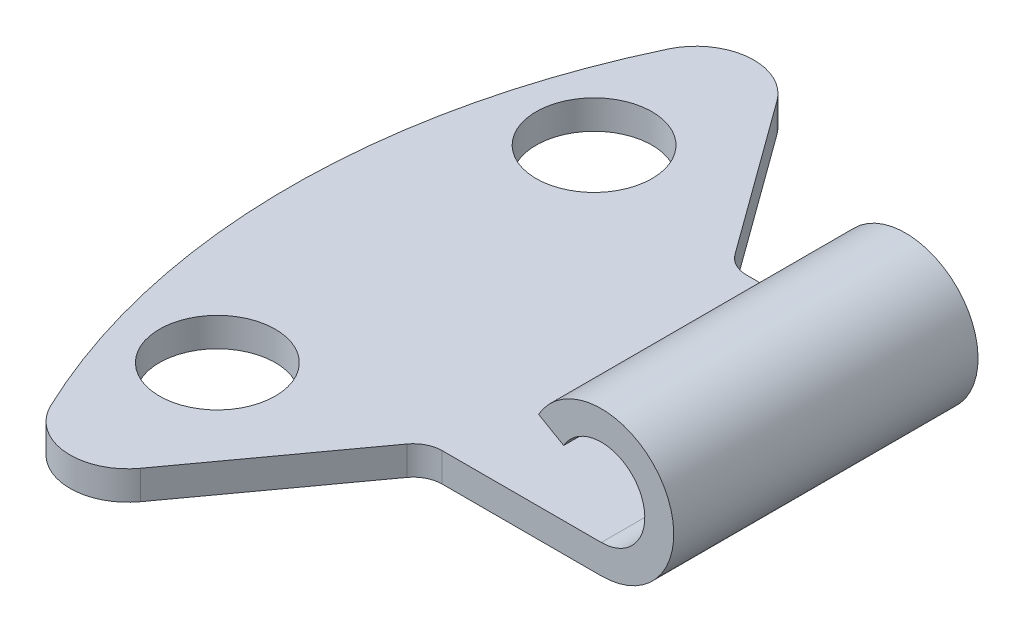
ISO-10303-21;
HEADER;
FILE_DESCRIPTION(('STEP AP214'),'2;1');
FILE_NAME('part.step','',(''),(''),'','','');
FILE_SCHEMA(('AUTOMOTIVE_DESIGN { 1 0 10303 214 1 1 1 1 }'));
ENDSEC;
DATA;
#1=APPLICATION_CONTEXT('core data for automotive mechanical design processes');
#2=APPLICATION_PROTOCOL_DEFINITION('international standard','automotive_design',2000,#1);
#3=PRODUCT_CONTEXT('',#1,'mechanical');
#4=PRODUCT('Part','Part','',(#3));
#5=PRODUCT_RELATED_PRODUCT_CATEGORY('part','',(#4));
#6=PRODUCT_DEFINITION_FORMATION('','',#4);
#7=PRODUCT_DEFINITION_CONTEXT('part definition',#1,'design');
#8=PRODUCT_DEFINITION('design','',#6,#7);
#9=PRODUCT_DEFINITION_SHAPE('','',#8);
#10=(LENGTH_UNIT() NAMED_UNIT(*) SI_UNIT(.MILLI.,.METRE.));
#11=(NAMED_UNIT(*) PLANE_ANGLE_UNIT() SI_UNIT($,.RADIAN.));
#12=(NAMED_UNIT(*) SI_UNIT($,.STERADIAN.) SOLID_ANGLE_UNIT());
#13=UNCERTAINTY_MEASURE_WITH_UNIT(LENGTH_MEASURE(1.E-05),#10,'distance_accuracy_value','');
#14=(GEOMETRIC_REPRESENTATION_CONTEXT(3) GLOBAL_UNCERTAINTY_ASSIGNED_CONTEXT((#13)) GLOBAL_UNIT_ASSIGNED_CONTEXT((#10,
#11,#12)) REPRESENTATION_CONTEXT('',''));
#15=CARTESIAN_POINT('',(0.,0.,0.));
#16=DIRECTION('',(0.,0.,1.));
#17=DIRECTION('',(1.,0.,0.));
#18=AXIS2_PLACEMENT_3D('',#15,#16,#17);
#19=CARTESIAN_POINT('',(8.,2.5,27.));
#20=DIRECTION('',(0.,0.,-1.));
#21=DIRECTION('',(-1.,0.,0.));
#22=AXIS2_PLACEMENT_3D('',#19,#20,#21);
#23=CYLINDRICAL_SURFACE('',#22,2.5);
#24=CARTESIAN_POINT('',(8.,2.5,8.25));
#25=DIRECTION('',(0.,0.,-1.));
#26=DIRECTION('',(-1.,0.,0.));
#27=AXIS2_PLACEMENT_3D('',#24,#25,#26);
#28=CIRCLE('',#27,2.5);
#29=CARTESIAN_POINT('',(5.83493649053891,3.75000000000001,8.25));
#30=VERTEX_POINT('',#29);
#31=CARTESIAN_POINT('',(8.,0.,8.25));
#32=VERTEX_POINT('',#31);
#33=EDGE_CURVE('E269',#30,#32,#28,.T.);
#34=ORIENTED_EDGE('',*,*,#33,.F.);
#35=DIRECTION('',(0.,0.,-1.));
#36=VECTOR('',#35,1.);
#37=CARTESIAN_POINT('',(5.83493649053891,3.75000000000001,27.));
#38=LINE('',#37,#36);
#39=CARTESIAN_POINT('',(5.83493649053891,3.75000000000001,18.75));
#40=VERTEX_POINT('',#39);
#41=EDGE_CURVE('E311',#40,#30,#38,.T.);
#42=ORIENTED_EDGE('',*,*,#41,.F.);
#43=CARTESIAN_POINT('',(8.,2.5,18.75));
#44=DIRECTION('',(0.,0.,1.));
#45=DIRECTION('',(1.,0.,0.));
#46=AXIS2_PLACEMENT_3D('',#43,#44,#45);
#47=CIRCLE('',#46,2.5);
#48=CARTESIAN_POINT('',(8.,0.,18.75));
#49=VERTEX_POINT('',#48);
#50=EDGE_CURVE('E294',#49,#40,#47,.T.);
#51=ORIENTED_EDGE('',*,*,#50,.F.);
#52=DIRECTION('',(0.,0.,-1.));
#53=VECTOR('',#52,1.);
#54=CARTESIAN_POINT('',(8.,0.,27.));
#55=LINE('',#54,#53);
#56=EDGE_CURVE('E314',#49,#32,#55,.T.);
#57=ORIENTED_EDGE('',*,*,#56,.T.);
#58=EDGE_LOOP('',(#34,#42,#51,#57));
#59=FACE_BOUND('',#58,.T.);
#60=ADVANCED_FACE('F146',(#59),#23,.T.);
#61=CARTESIAN_POINT('',(5.83493649053891,3.75000000000001,27.));
#62=DIRECTION('',(0.500000000000003,0.866025403784437,0.));
#63=DIRECTION('',(-0.866025403784437,0.500000000000003,0.));
#64=AXIS2_PLACEMENT_3D('',#61,#62,#63);
#65=PLANE('',#64);
#66=DIRECTION('',(-0.866025403784437,0.500000000000003,0.));
#67=VECTOR('',#66,1.);
#68=CARTESIAN_POINT('',(5.8349364905389,3.75000000000002,8.25));
#69=LINE('',#68,#67);
#70=CARTESIAN_POINT('',(6.70096189432335,3.25000000000001,8.25));
#71=VERTEX_POINT('',#70);
#72=EDGE_CURVE('E267',#71,#30,#69,.T.);
#73=ORIENTED_EDGE('',*,*,#72,.F.);
#74=DIRECTION('',(0.,0.,-1.));
#75=VECTOR('',#74,1.);
#76=CARTESIAN_POINT('',(6.70096189432335,3.25000000000001,27.));
#77=LINE('',#76,#75);
#78=CARTESIAN_POINT('',(6.70096189432335,3.25000000000001,18.75));
#79=VERTEX_POINT('',#78);
#80=EDGE_CURVE('E308',#79,#71,#77,.T.);
#81=ORIENTED_EDGE('',*,*,#80,.F.);
#82=DIRECTION('',(0.866025403784437,-0.500000000000003,0.));
#83=VECTOR('',#82,1.);
#84=CARTESIAN_POINT('',(5.83493649053891,3.75000000000001,18.75));
#85=LINE('',#84,#83);
#86=EDGE_CURVE('E292',#40,#79,#85,.T.);
#87=ORIENTED_EDGE('',*,*,#86,.F.);
#88=ORIENTED_EDGE('',*,*,#41,.T.);
#89=EDGE_LOOP('',(#73,#81,#87,#88));
#90=FACE_BOUND('',#89,.T.);
#91=ADVANCED_FACE('F348',(#90),#65,.F.);
#92=CARTESIAN_POINT('',(8.,2.5,27.));
#93=DIRECTION('',(0.,0.,-1.));
#94=DIRECTION('',(-1.,0.,0.));
#95=AXIS2_PLACEMENT_3D('',#92,#93,#94);
#96=CYLINDRICAL_SURFACE('',#95,1.5);
#97=CARTESIAN_POINT('',(8.,2.5,8.25));
#98=DIRECTION('',(0.,0.,-1.));
#99=DIRECTION('',(-1.,0.,0.));
#100=AXIS2_PLACEMENT_3D('',#97,#98,#99);
#101=CIRCLE('',#100,1.5);
#102=CARTESIAN_POINT('',(8.,1.,8.25));
#103=VERTEX_POINT('',#102);
#104=EDGE_CURVE('E247',#103,#71,#101,.F.);
#105=ORIENTED_EDGE('',*,*,#104,.F.);
#106=DIRECTION('',(0.,0.,-1.));
#107=VECTOR('',#106,1.);
#108=CARTESIAN_POINT('',(8.,1.,27.));
#109=LINE('',#108,#107);
#110=CARTESIAN_POINT('',(8.,1.,18.75));
#111=VERTEX_POINT('',#110);
#112=EDGE_CURVE('E305',#111,#103,#109,.T.);
#113=ORIENTED_EDGE('',*,*,#112,.F.);
#114=CARTESIAN_POINT('',(8.,2.5,18.75));
#115=DIRECTION('',(0.,0.,1.));
#116=DIRECTION('',(1.,0.,0.));
#117=AXIS2_PLACEMENT_3D('',#114,#115,#116);
#118=CIRCLE('',#117,1.5);
#119=EDGE_CURVE('E161',#79,#111,#118,.F.);
#120=ORIENTED_EDGE('',*,*,#119,.F.);
#121=ORIENTED_EDGE('',*,*,#80,.T.);
#122=EDGE_LOOP('',(#105,#113,#120,#121));
#123=FACE_BOUND('',#122,.T.);
#124=ADVANCED_FACE('F343',(#123),#96,.F.);
#125=CARTESIAN_POINT('',(-8.,0.,27.));
#126=DIRECTION('',(0.,1.,0.));
#127=DIRECTION('',(0.,0.,1.));
#128=AXIS2_PLACEMENT_3D('',#125,#126,#127);
#129=PLANE('',#128);
#130=CARTESIAN_POINT('',(-4.,0.,20.));
#131=DIRECTION('',(0.,1.,0.));
#132=DIRECTION('',(0.,0.,1.));
#133=AXIS2_PLACEMENT_3D('',#130,#131,#132);
#134=CIRCLE('',#133,2.);
#135=CARTESIAN_POINT('',(-4.,0.,22.));
#136=VERTEX_POINT('',#135);
#137=EDGE_CURVE('E284',#136,#136,#134,.F.);
#138=ORIENTED_EDGE('',*,*,#137,.F.);
#139=EDGE_LOOP('',(#138));
#140=FACE_BOUND('',#139,.T.);
#141=CARTESIAN_POINT('',(-4.,0.,7.));
#142=DIRECTION('',(0.,1.,0.));
#143=DIRECTION('',(0.,0.,1.));
#144=AXIS2_PLACEMENT_3D('',#141,#142,#143);
#145=CIRCLE('',#144,2.);
#146=CARTESIAN_POINT('',(-4.,0.,9.));
#147=VERTEX_POINT('',#146);
#148=EDGE_CURVE('E288',#147,#147,#145,.F.);
#149=ORIENTED_EDGE('',*,*,#148,.F.);
#150=EDGE_LOOP('',(#149));
#151=FACE_BOUND('',#150,.T.);
#152=DIRECTION('',(-1.,0.,0.));
#153=VECTOR('',#152,1.);
#154=CARTESIAN_POINT('',(-8.00000000000001,0.,8.25000000000001));
#155=LINE('',#154,#153);
#156=CARTESIAN_POINT('',(2.50922459170322,0.,8.25));
#157=VERTEX_POINT('',#156);
#158=EDGE_CURVE('E271',#32,#157,#155,.T.);
#159=ORIENTED_EDGE('',*,*,#158,.F.);
#160=ORIENTED_EDGE('',*,*,#56,.F.);
#161=DIRECTION('',(1.,0.,0.));
#162=VECTOR('',#161,1.);
#163=CARTESIAN_POINT('',(-8.,0.,18.75));
#164=LINE('',#163,#162);
#165=CARTESIAN_POINT('',(2.50922459170323,0.,18.75));
#166=VERTEX_POINT('',#165);
#167=EDGE_CURVE('E296',#166,#49,#164,.T.);
#168=ORIENTED_EDGE('',*,*,#167,.F.);
#169=CARTESIAN_POINT('',(2.50922459170322,0.,19.75));
#170=DIRECTION('',(0.,1.,0.));
#171=DIRECTION('',(0.,0.,1.));
#172=AXIS2_PLACEMENT_3D('',#169,#170,#171);
#173=CIRCLE('',#172,1.);
#174=CARTESIAN_POINT('',(1.70048850740003,0.,19.1618283023249));
#175=VERTEX_POINT('',#174);
#176=EDGE_CURVE('E303',#175,#166,#173,.F.);
#177=ORIENTED_EDGE('',*,*,#176,.F.);
#178=DIRECTION('',(0.588171697675046,0.,-0.808736084303189));
#179=VECTOR('',#178,1.);
#180=CARTESIAN_POINT('',(-5.38378378378378,0.,28.9027027027027));
#181=LINE('',#180,#179);
#182=CARTESIAN_POINT('',(-2.16600265264094,0.,24.4782536473813));
#183=VERTEX_POINT('',#182);
#184=EDGE_CURVE('E169',#183,#175,#181,.T.);
#185=ORIENTED_EDGE('',*,*,#184,.F.);
#186=CARTESIAN_POINT('',(-3.78347482124732,0.,23.3019102520312));
#187=DIRECTION('',(0.,1.,0.));
#188=DIRECTION('',(0.,0.,1.));
#189=AXIS2_PLACEMENT_3D('',#186,#187,#188);
#190=CIRCLE('',#189,2.);
#191=CARTESIAN_POINT('',(-5.5888827616586,0.,24.1624346088625));
#192=VERTEX_POINT('',#191);
#193=EDGE_CURVE('E300',#192,#183,#190,.T.);
#194=ORIENTED_EDGE('',*,*,#193,.F.);
#195=CARTESIAN_POINT('',(16.78125,0.,13.5));
#196=DIRECTION('',(0.,1.,0.));
#197=DIRECTION('',(0.,0.,1.));
#198=AXIS2_PLACEMENT_3D('',#195,#196,#197);
#199=CIRCLE('',#198,24.78125);
#200=CARTESIAN_POINT('',(-5.58888276165861,0.,2.83756539113753));
#201=VERTEX_POINT('',#200);
#202=EDGE_CURVE('E298',#201,#192,#199,.T.);
#203=ORIENTED_EDGE('',*,*,#202,.F.);
#204=CARTESIAN_POINT('',(-3.78347482124732,0.,3.6980897479688));
#205=DIRECTION('',(0.,1.,0.));
#206=DIRECTION('',(0.,0.,1.));
#207=AXIS2_PLACEMENT_3D('',#204,#205,#206);
#208=CIRCLE('',#207,2.);
#209=CARTESIAN_POINT('',(-2.16600265264094,0.,2.52174635261871));
#210=VERTEX_POINT('',#209);
#211=EDGE_CURVE('E248',#210,#201,#208,.T.);
#212=ORIENTED_EDGE('',*,*,#211,.F.);
#213=DIRECTION('',(-0.588171697675046,0.,-0.808736084303189));
#214=VECTOR('',#213,1.);
#215=CARTESIAN_POINT('',(7.45945945945946,0.,15.7567567567568));
#216=LINE('',#215,#214);
#217=CARTESIAN_POINT('',(1.70048850740003,0.,7.83817169767505));
#218=VERTEX_POINT('',#217);
#219=EDGE_CURVE('E253',#218,#210,#216,.T.);
#220=ORIENTED_EDGE('',*,*,#219,.F.);
#221=CARTESIAN_POINT('',(2.50922459170322,0.,7.25));
#222=DIRECTION('',(0.,1.,0.));
#223=DIRECTION('',(0.,0.,1.));
#224=AXIS2_PLACEMENT_3D('',#221,#222,#223);
#225=CIRCLE('',#224,1.);
#226=EDGE_CURVE('E237',#157,#218,#225,.F.);
#227=ORIENTED_EDGE('',*,*,#226,.F.);
#228=EDGE_LOOP('',(#159,#160,#168,#177,#185,#194,#203,#212,#220,#227));
#229=FACE_BOUND('',#228,.T.);
#230=ADVANCED_FACE('F148',(#140,#151,#229),#129,.F.);
#231=CARTESIAN_POINT('',(-8.,1.,27.));
#232=DIRECTION('',(0.,-1.,0.));
#233=DIRECTION('',(1.,0.,0.));
#234=AXIS2_PLACEMENT_3D('',#231,#232,#233);
#235=PLANE('',#234);
#236=CARTESIAN_POINT('',(-4.,1.,20.));
#237=DIRECTION('',(0.,-1.,0.));
#238=DIRECTION('',(1.,0.,0.));
#239=AXIS2_PLACEMENT_3D('',#236,#237,#238);
#240=CIRCLE('',#239,2.);
#241=CARTESIAN_POINT('',(-2.,1.,20.));
#242=VERTEX_POINT('',#241);
#243=EDGE_CURVE('E283',#242,#242,#240,.F.);
#244=ORIENTED_EDGE('',*,*,#243,.F.);
#245=EDGE_LOOP('',(#244));
#246=FACE_BOUND('',#245,.T.);
#247=CARTESIAN_POINT('',(-4.,1.,7.));
#248=DIRECTION('',(0.,-1.,0.));
#249=DIRECTION('',(1.,0.,0.));
#250=AXIS2_PLACEMENT_3D('',#247,#248,#249);
#251=CIRCLE('',#250,2.);
#252=CARTESIAN_POINT('',(-2.,1.,7.));
#253=VERTEX_POINT('',#252);
#254=EDGE_CURVE('E287',#253,#253,#251,.F.);
#255=ORIENTED_EDGE('',*,*,#254,.F.);
#256=EDGE_LOOP('',(#255));
#257=FACE_BOUND('',#256,.T.);
#258=DIRECTION('',(1.,0.,0.));
#259=VECTOR('',#258,1.);
#260=CARTESIAN_POINT('',(-8.00000000000001,1.,8.25000000000001));
#261=LINE('',#260,#259);
#262=CARTESIAN_POINT('',(2.50922459170322,1.,8.25));
#263=VERTEX_POINT('',#262);
#264=EDGE_CURVE('E12',#263,#103,#261,.T.);
#265=ORIENTED_EDGE('',*,*,#264,.F.);
#266=CARTESIAN_POINT('',(2.50922459170322,1.,7.25));
#267=DIRECTION('',(0.,-1.,0.));
#268=DIRECTION('',(1.,0.,0.));
#269=AXIS2_PLACEMENT_3D('',#266,#267,#268);
#270=CIRCLE('',#269,1.);
#271=CARTESIAN_POINT('',(1.70048850740003,1.,7.83817169767505));
#272=VERTEX_POINT('',#271);
#273=EDGE_CURVE('E154',#272,#263,#270,.F.);
#274=ORIENTED_EDGE('',*,*,#273,.F.);
#275=DIRECTION('',(0.588171697675046,0.,0.808736084303189));
#276=VECTOR('',#275,1.);
#277=CARTESIAN_POINT('',(7.45945945945946,1.,15.7567567567568));
#278=LINE('',#277,#276);
#279=CARTESIAN_POINT('',(-2.16600265264094,1.,2.52174635261871));
#280=VERTEX_POINT('',#279);
#281=EDGE_CURVE('E256',#280,#272,#278,.T.);
#282=ORIENTED_EDGE('',*,*,#281,.F.);
#283=CARTESIAN_POINT('',(-3.78347482124732,1.,3.6980897479688));
#284=DIRECTION('',(0.,-1.,0.));
#285=DIRECTION('',(1.,0.,0.));
#286=AXIS2_PLACEMENT_3D('',#283,#284,#285);
#287=CIRCLE('',#286,2.);
#288=CARTESIAN_POINT('',(-5.58888276165861,1.,2.83756539113753));
#289=VERTEX_POINT('',#288);
#290=EDGE_CURVE('E332',#289,#280,#287,.T.);
#291=ORIENTED_EDGE('',*,*,#290,.F.);
#292=CARTESIAN_POINT('',(16.78125,1.,13.5));
#293=DIRECTION('',(0.,-1.,0.));
#294=DIRECTION('',(1.,0.,0.));
#295=AXIS2_PLACEMENT_3D('',#292,#293,#294);
#296=CIRCLE('',#295,24.78125);
#297=CARTESIAN_POINT('',(-5.5888827616586,1.00000000000001,24.1624346088625));
#298=VERTEX_POINT('',#297);
#299=EDGE_CURVE('E329',#298,#289,#296,.T.);
#300=ORIENTED_EDGE('',*,*,#299,.F.);
#301=CARTESIAN_POINT('',(-3.78347482124732,1.,23.3019102520312));
#302=DIRECTION('',(0.,-1.,0.));
#303=DIRECTION('',(1.,0.,0.));
#304=AXIS2_PLACEMENT_3D('',#301,#302,#303);
#305=CIRCLE('',#304,2.);
#306=CARTESIAN_POINT('',(-2.16600265264094,1.,24.4782536473813));
#307=VERTEX_POINT('',#306);
#308=EDGE_CURVE('E327',#307,#298,#305,.T.);
#309=ORIENTED_EDGE('',*,*,#308,.F.);
#310=DIRECTION('',(-0.588171697675046,0.,0.808736084303189));
#311=VECTOR('',#310,1.);
#312=CARTESIAN_POINT('',(-5.38378378378378,1.,28.9027027027027));
#313=LINE('',#312,#311);
#314=CARTESIAN_POINT('',(1.70048850740003,1.,19.1618283023249));
#315=VERTEX_POINT('',#314);
#316=EDGE_CURVE('E325',#315,#307,#313,.T.);
#317=ORIENTED_EDGE('',*,*,#316,.F.);
#318=CARTESIAN_POINT('',(2.50922459170322,1.,19.75));
#319=DIRECTION('',(0.,-1.,0.));
#320=DIRECTION('',(1.,0.,0.));
#321=AXIS2_PLACEMENT_3D('',#318,#319,#320);
#322=CIRCLE('',#321,1.);
#323=CARTESIAN_POINT('',(2.50922459170323,1.,18.75));
#324=VERTEX_POINT('',#323);
#325=EDGE_CURVE('E323',#324,#315,#322,.F.);
#326=ORIENTED_EDGE('',*,*,#325,.F.);
#327=DIRECTION('',(-1.,0.,0.));
#328=VECTOR('',#327,1.);
#329=CARTESIAN_POINT('',(-8.,1.,18.75));
#330=LINE('',#329,#328);
#331=EDGE_CURVE('E317',#111,#324,#330,.T.);
#332=ORIENTED_EDGE('',*,*,#331,.F.);
#333=ORIENTED_EDGE('',*,*,#112,.T.);
#334=EDGE_LOOP('',(#265,#274,#282,#291,#300,#309,#317,#326,#332,#333));
#335=FACE_BOUND('',#334,.T.);
#336=ADVANCED_FACE('F339',(#246,#257,#335),#235,.F.);
#337=CARTESIAN_POINT('',(-4.,28.,20.));
#338=DIRECTION('',(0.,-1.,0.));
#339=DIRECTION('',(1.,0.,0.));
#340=AXIS2_PLACEMENT_3D('',#337,#338,#339);
#341=CYLINDRICAL_SURFACE('',#340,2.);
#342=ORIENTED_EDGE('',*,*,#243,.T.);
#343=EDGE_LOOP('',(#342));
#344=FACE_BOUND('',#343,.T.);
#345=ORIENTED_EDGE('',*,*,#137,.T.);
#346=EDGE_LOOP('',(#345));
#347=FACE_BOUND('',#346,.T.);
#348=ADVANCED_FACE('F395',(#344,#347),#341,.F.);
#349=CARTESIAN_POINT('',(-4.,28.,7.));
#350=DIRECTION('',(0.,-1.,0.));
#351=DIRECTION('',(1.,0.,0.));
#352=AXIS2_PLACEMENT_3D('',#349,#350,#351);
#353=CYLINDRICAL_SURFACE('',#352,2.);
#354=ORIENTED_EDGE('',*,*,#254,.T.);
#355=EDGE_LOOP('',(#354));
#356=FACE_BOUND('',#355,.T.);
#357=ORIENTED_EDGE('',*,*,#148,.T.);
#358=EDGE_LOOP('',(#357));
#359=FACE_BOUND('',#358,.T.);
#360=ADVANCED_FACE('F398',(#356,#359),#353,.F.);
#361=CARTESIAN_POINT('',(2.50922459170322,28.,19.75));
#362=DIRECTION('',(0.,-1.,0.));
#363=DIRECTION('',(1.,0.,0.));
#364=AXIS2_PLACEMENT_3D('',#361,#362,#363);
#365=CYLINDRICAL_SURFACE('',#364,1.);
#366=ORIENTED_EDGE('',*,*,#176,.T.);
#367=DIRECTION('',(0.,-1.,0.));
#368=VECTOR('',#367,1.);
#369=CARTESIAN_POINT('',(2.50922459170322,28.,18.75));
#370=LINE('',#369,#368);
#371=EDGE_CURVE('E273',#324,#166,#370,.T.);
#372=ORIENTED_EDGE('',*,*,#371,.F.);
#373=ORIENTED_EDGE('',*,*,#325,.T.);
#374=DIRECTION('',(0.,-1.,0.));
#375=VECTOR('',#374,1.);
#376=CARTESIAN_POINT('',(1.70048850740003,28.,19.1618283023249));
#377=LINE('',#376,#375);
#378=EDGE_CURVE('E276',#315,#175,#377,.T.);
#379=ORIENTED_EDGE('',*,*,#378,.T.);
#380=EDGE_LOOP('',(#366,#372,#373,#379));
#381=FACE_BOUND('',#380,.T.);
#382=ADVANCED_FACE('F359',(#381),#365,.F.);
#383=CARTESIAN_POINT('',(10.227027027027,28.,7.43783783783783));
#384=DIRECTION('',(0.808736084303189,0.,0.588171697675046));
#385=DIRECTION('',(0.588171697675046,0.,-0.808736084303189));
#386=AXIS2_PLACEMENT_3D('',#383,#384,#385);
#387=PLANE('',#386);
#388=ORIENTED_EDGE('',*,*,#184,.T.);
#389=ORIENTED_EDGE('',*,*,#378,.F.);
#390=ORIENTED_EDGE('',*,*,#316,.T.);
#391=DIRECTION('',(0.,-1.,0.));
#392=VECTOR('',#391,1.);
#393=CARTESIAN_POINT('',(-2.16600265264094,28.,24.4782536473813));
#394=LINE('',#393,#392);
#395=EDGE_CURVE('E278',#307,#183,#394,.T.);
#396=ORIENTED_EDGE('',*,*,#395,.T.);
#397=EDGE_LOOP('',(#388,#389,#390,#396));
#398=FACE_BOUND('',#397,.T.);
#399=ADVANCED_FACE('F364',(#398),#387,.T.);
#400=CARTESIAN_POINT('',(-3.78347482124732,28.,23.3019102520312));
#401=DIRECTION('',(0.,-1.,0.));
#402=DIRECTION('',(1.,0.,0.));
#403=AXIS2_PLACEMENT_3D('',#400,#401,#402);
#404=CYLINDRICAL_SURFACE('',#403,2.);
#405=ORIENTED_EDGE('',*,*,#193,.T.);
#406=ORIENTED_EDGE('',*,*,#395,.F.);
#407=ORIENTED_EDGE('',*,*,#308,.T.);
#408=DIRECTION('',(0.,-1.,0.));
#409=VECTOR('',#408,1.);
#410=CARTESIAN_POINT('',(-5.58888276165861,28.,24.1624346088625));
#411=LINE('',#410,#409);
#412=EDGE_CURVE('E280',#298,#192,#411,.T.);
#413=ORIENTED_EDGE('',*,*,#412,.T.);
#414=EDGE_LOOP('',(#405,#406,#407,#413));
#415=FACE_BOUND('',#414,.T.);
#416=ADVANCED_FACE('F366',(#415),#404,.T.);
#417=CARTESIAN_POINT('',(16.78125,28.,13.5));
#418=DIRECTION('',(0.,-1.,0.));
#419=DIRECTION('',(1.,0.,0.));
#420=AXIS2_PLACEMENT_3D('',#417,#418,#419);
#421=CYLINDRICAL_SURFACE('',#420,24.78125);
#422=ORIENTED_EDGE('',*,*,#202,.T.);
#423=ORIENTED_EDGE('',*,*,#412,.F.);
#424=ORIENTED_EDGE('',*,*,#299,.T.);
#425=DIRECTION('',(0.,1.,0.));
#426=VECTOR('',#425,1.);
#427=CARTESIAN_POINT('',(-5.58888276165861,-26.,2.83756539113753));
#428=LINE('',#427,#426);
#429=EDGE_CURVE('E338',#201,#289,#428,.T.);
#430=ORIENTED_EDGE('',*,*,#429,.F.);
#431=EDGE_LOOP('',(#422,#423,#424,#430));
#432=FACE_BOUND('',#431,.T.);
#433=ADVANCED_FACE('F375',(#432),#421,.T.);
#434=CARTESIAN_POINT('',(0.,28.,18.75));
#435=DIRECTION('',(0.,0.,1.));
#436=DIRECTION('',(1.,0.,0.));
#437=AXIS2_PLACEMENT_3D('',#434,#435,#436);
#438=PLANE('',#437);
#439=ORIENTED_EDGE('',*,*,#167,.T.);
#440=ORIENTED_EDGE('',*,*,#50,.T.);
#441=ORIENTED_EDGE('',*,*,#86,.T.);
#442=ORIENTED_EDGE('',*,*,#119,.T.);
#443=ORIENTED_EDGE('',*,*,#331,.T.);
#444=ORIENTED_EDGE('',*,*,#371,.T.);
#445=EDGE_LOOP('',(#439,#440,#441,#442,#443,#444));
#446=FACE_BOUND('',#445,.T.);
#447=ADVANCED_FACE('F356',(#446),#438,.T.);
#448=CARTESIAN_POINT('',(0.,-26.,8.25000000000001));
#449=DIRECTION('',(0.,0.,-1.));
#450=DIRECTION('',(-1.,0.,0.));
#451=AXIS2_PLACEMENT_3D('',#448,#449,#450);
#452=PLANE('',#451);
#453=ORIENTED_EDGE('',*,*,#158,.T.);
#454=DIRECTION('',(0.,1.,0.));
#455=VECTOR('',#454,1.);
#456=CARTESIAN_POINT('',(2.50922459170323,-26.,8.25));
#457=LINE('',#456,#455);
#458=EDGE_CURVE('E243',#157,#263,#457,.T.);
#459=ORIENTED_EDGE('',*,*,#458,.T.);
#460=ORIENTED_EDGE('',*,*,#264,.T.);
#461=ORIENTED_EDGE('',*,*,#104,.T.);
#462=ORIENTED_EDGE('',*,*,#72,.T.);
#463=ORIENTED_EDGE('',*,*,#33,.T.);
#464=EDGE_LOOP('',(#453,#459,#460,#461,#462,#463));
#465=FACE_BOUND('',#464,.T.);
#466=ADVANCED_FACE('F336',(#465),#452,.T.);
#467=CARTESIAN_POINT('',(2.50922459170322,-26.,7.25));
#468=DIRECTION('',(0.,1.,0.));
#469=DIRECTION('',(-1.,0.,0.));
#470=AXIS2_PLACEMENT_3D('',#467,#468,#469);
#471=CYLINDRICAL_SURFACE('',#470,1.);
#472=ORIENTED_EDGE('',*,*,#226,.T.);
#473=DIRECTION('',(0.,1.,0.));
#474=VECTOR('',#473,1.);
#475=CARTESIAN_POINT('',(1.70048850740003,-26.,7.83817169767505));
#476=LINE('',#475,#474);
#477=EDGE_CURVE('E240',#218,#272,#476,.T.);
#478=ORIENTED_EDGE('',*,*,#477,.T.);
#479=ORIENTED_EDGE('',*,*,#273,.T.);
#480=ORIENTED_EDGE('',*,*,#458,.F.);
#481=EDGE_LOOP('',(#472,#478,#479,#480));
#482=FACE_BOUND('',#481,.T.);
#483=ADVANCED_FACE('F239',(#482),#471,.F.);
#484=CARTESIAN_POINT('',(-3.78347482124732,-26.,3.6980897479688));
#485=DIRECTION('',(0.,1.,0.));
#486=DIRECTION('',(-1.,0.,0.));
#487=AXIS2_PLACEMENT_3D('',#484,#485,#486);
#488=CYLINDRICAL_SURFACE('',#487,2.);
#489=ORIENTED_EDGE('',*,*,#211,.T.);
#490=ORIENTED_EDGE('',*,*,#429,.T.);
#491=ORIENTED_EDGE('',*,*,#290,.T.);
#492=DIRECTION('',(0.,1.,0.));
#493=VECTOR('',#492,1.);
#494=CARTESIAN_POINT('',(-2.16600265264094,-26.,2.52174635261871));
#495=LINE('',#494,#493);
#496=EDGE_CURVE('E257',#210,#280,#495,.T.);
#497=ORIENTED_EDGE('',*,*,#496,.F.);
#498=EDGE_LOOP('',(#489,#490,#491,#497));
#499=FACE_BOUND('',#498,.T.);
#500=ADVANCED_FACE('F373',(#499),#488,.T.);
#501=CARTESIAN_POINT('',(-2.61621621621622,-26.,1.9027027027027));
#502=DIRECTION('',(0.808736084303189,0.,-0.588171697675046));
#503=DIRECTION('',(-0.588171697675046,0.,-0.808736084303189));
#504=AXIS2_PLACEMENT_3D('',#501,#502,#503);
#505=PLANE('',#504);
#506=ORIENTED_EDGE('',*,*,#219,.T.);
#507=ORIENTED_EDGE('',*,*,#496,.T.);
#508=ORIENTED_EDGE('',*,*,#281,.T.);
#509=ORIENTED_EDGE('',*,*,#477,.F.);
#510=EDGE_LOOP('',(#506,#507,#508,#509));
#511=FACE_BOUND('',#510,.T.);
#512=ADVANCED_FACE('F251',(#511),#505,.T.);
#513=CLOSED_SHELL('',(#60,#91,#124,#230,#336,#348,#360,#382,#399,#416,#433,#447,#466,#483,#500,#512));
#514=MANIFOLD_SOLID_BREP('B2',#513);
#515=ADVANCED_BREP_SHAPE_REPRESENTATION('',(#18,#514),#14);
#516=SHAPE_DEFINITION_REPRESENTATION(#9,#515);
ENDSEC;
END-ISO-10303-21;
